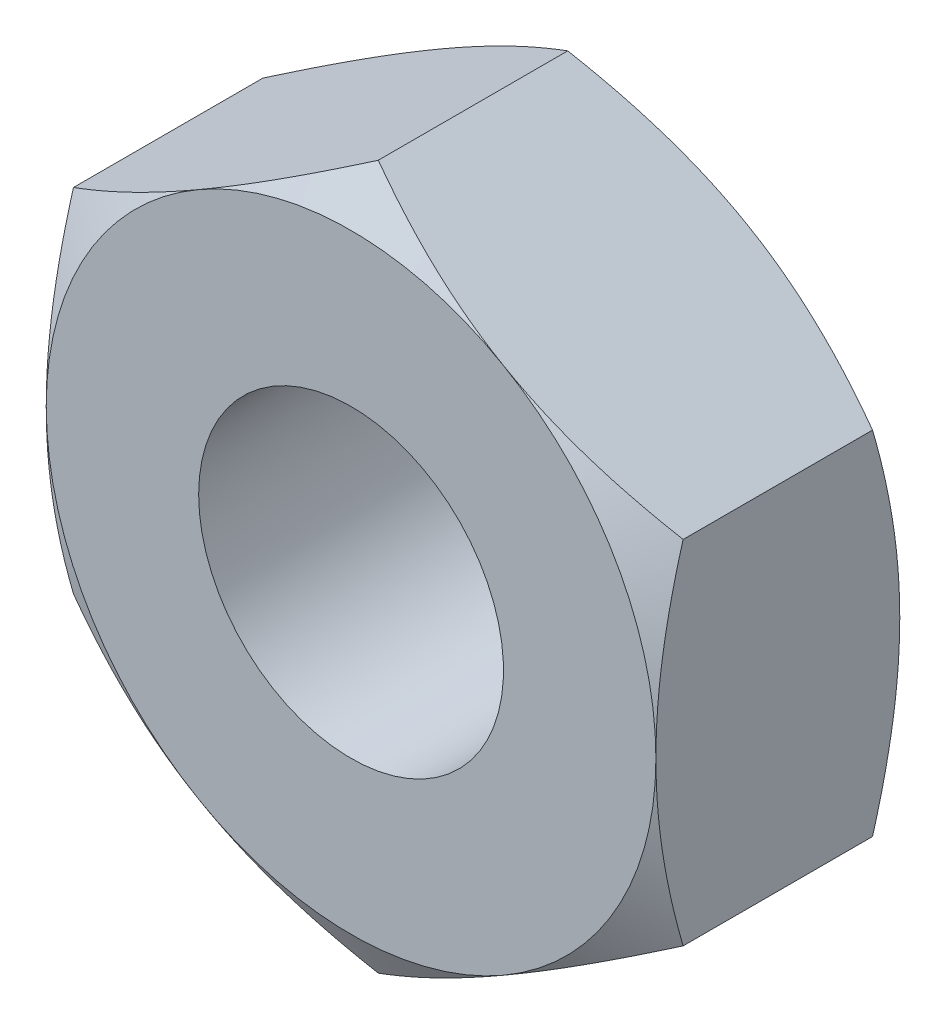
ISO-10303-21;
HEADER;
FILE_DESCRIPTION(('STEP AP214'),'2;1');
FILE_NAME('part.step','',(''),(''),'','','');
FILE_SCHEMA(('AUTOMOTIVE_DESIGN { 1 0 10303 214 1 1 1 1 }'));
ENDSEC;
DATA;
#1=APPLICATION_CONTEXT('core data for automotive mechanical design processes');
#2=APPLICATION_PROTOCOL_DEFINITION('international standard','automotive_design',2000,#1);
#3=PRODUCT_CONTEXT('',#1,'mechanical');
#4=PRODUCT('Part','Part','',(#3));
#5=PRODUCT_RELATED_PRODUCT_CATEGORY('part','',(#4));
#6=PRODUCT_DEFINITION_FORMATION('','',#4);
#7=PRODUCT_DEFINITION_CONTEXT('part definition',#1,'design');
#8=PRODUCT_DEFINITION('design','',#6,#7);
#9=PRODUCT_DEFINITION_SHAPE('','',#8);
#10=(LENGTH_UNIT() NAMED_UNIT(*) SI_UNIT(.MILLI.,.METRE.));
#11=(NAMED_UNIT(*) PLANE_ANGLE_UNIT() SI_UNIT($,.RADIAN.));
#12=(NAMED_UNIT(*) SI_UNIT($,.STERADIAN.) SOLID_ANGLE_UNIT());
#13=UNCERTAINTY_MEASURE_WITH_UNIT(LENGTH_MEASURE(1.E-05),#10,'distance_accuracy_value','');
#14=(GEOMETRIC_REPRESENTATION_CONTEXT(3) GLOBAL_UNCERTAINTY_ASSIGNED_CONTEXT((#13)) GLOBAL_UNIT_ASSIGNED_CONTEXT((#10,
#11,#12)) REPRESENTATION_CONTEXT('',''));
#15=CARTESIAN_POINT('',(0.,0.,0.));
#16=DIRECTION('',(0.,0.,1.));
#17=DIRECTION('',(1.,0.,0.));
#18=AXIS2_PLACEMENT_3D('',#15,#16,#17);
#19=CARTESIAN_POINT('',(0.,2.88675134594813,1.));
#20=DIRECTION('',(0.5,-0.866025403784438,0.));
#21=DIRECTION('',(0.866025403784438,0.5,0.));
#22=AXIS2_PLACEMENT_3D('',#19,#20,#21);
#23=PLANE('',#22);
#24=DIRECTION('',(0.,0.,-1.));
#25=VECTOR('',#24,1.);
#26=CARTESIAN_POINT('',(0.,2.88675134594813,1.));
#27=LINE('',#26,#25);
#28=CARTESIAN_POINT('',(0.,2.88675134594813,0.776709006307399));
#29=VERTEX_POINT('',#28);
#30=CARTESIAN_POINT('',(0.,2.88675134594813,-0.776709006307399));
#31=VERTEX_POINT('',#30);
#32=EDGE_CURVE('E254',#29,#31,#27,.T.);
#33=ORIENTED_EDGE('',*,*,#32,.T.);
#34=CARTESIAN_POINT('',(0.000199999999999784,2.88686681600197,-0.776642335640892));
#35=CARTESIAN_POINT('',(-0.109663234734872,2.82343724785375,-0.813278379892374));
#36=CARTESIAN_POINT('',(-0.220474799896526,2.75946016087834,-0.846597781034944));
#37=CARTESIAN_POINT('',(-0.44401683346605,2.63039810762178,-0.904757714442142));
#38=CARTESIAN_POINT('',(-0.556751274528388,2.5653108477275,-0.929577670852262));
#39=CARTESIAN_POINT('',(-0.780822993875269,2.43594298024479,-0.968214348558948));
#40=CARTESIAN_POINT('',(-0.892125791767377,2.37168227992023,-0.982288203814361));
#41=CARTESIAN_POINT('',(-1.11525522746833,2.24285844015415,-0.99909084764725));
#42=CARTESIAN_POINT('',(-1.22708105401423,2.17829576909553,-1.00183354879637));
#43=CARTESIAN_POINT('',(-1.43604197555152,2.05765212479586,-0.996134239991947));
#44=CARTESIAN_POINT('',(-1.53320831755773,2.0015531110824,-0.989091605618139));
#45=CARTESIAN_POINT('',(-1.726907949711,1.88972057631678,-0.966768580875058));
#46=CARTESIAN_POINT('',(-1.82344056965973,1.8339874422038,-0.951480561559734));
#47=CARTESIAN_POINT('',(-2.01753972174048,1.7219242445005,-0.913260906155581));
#48=CARTESIAN_POINT('',(-2.11508168178214,1.66560836761316,-0.890167223874483));
#49=CARTESIAN_POINT('',(-2.30871060807609,1.55381665489446,-0.837753343422087));
#50=CARTESIAN_POINT('',(-2.40480005588618,1.49833938633502,-0.808445464375452));
#51=CARTESIAN_POINT('',(-2.5002,1.44326020292023,-0.776642335640893));
#52=B_SPLINE_CURVE_WITH_KNOTS('',3,(#34,#35,#36,#37,#38,#39,#40,#41,#42,#43,#44,#45,#46,#47,#48,
#49,#50,#51),.UNSPECIFIED.,.F.,.F.,(4,2,2,2,2,2,2,2,4),(0.,0.396285827362227,0.793524330152051,
1.18093086852114,1.56786160134475,1.90479741793733,2.24204551660463,2.58677531536756,
2.93082800105256),.UNSPECIFIED.);
#53=CARTESIAN_POINT('',(-1.25,2.1650635094611,-1.));
#54=VERTEX_POINT('',#53);
#55=EDGE_CURVE('E61',#31,#54,#52,.T.);
#56=ORIENTED_EDGE('',*,*,#55,.T.);
#57=CARTESIAN_POINT('',(-2.5,1.44337567297406,-0.776709006307399));
#58=VERTEX_POINT('',#57);
#59=EDGE_CURVE('E181',#54,#58,#52,.T.);
#60=ORIENTED_EDGE('',*,*,#59,.T.);
#61=DIRECTION('',(0.,0.,-1.));
#62=VECTOR('',#61,1.);
#63=CARTESIAN_POINT('',(-2.5,1.44337567297406,1.));
#64=LINE('',#63,#62);
#65=CARTESIAN_POINT('',(-2.5,1.44337567297406,0.776709006307399));
#66=VERTEX_POINT('',#65);
#67=EDGE_CURVE('E269',#66,#58,#64,.T.);
#68=ORIENTED_EDGE('',*,*,#67,.F.);
#69=CARTESIAN_POINT('',(0.000199999999999784,2.88686681600197,0.776642335640892));
#70=CARTESIAN_POINT('',(-0.109663234734872,2.82343724785375,0.813278379892374));
#71=CARTESIAN_POINT('',(-0.220474799896526,2.75946016087834,0.846597781034944));
#72=CARTESIAN_POINT('',(-0.44401683346605,2.63039810762178,0.904757714442142));
#73=CARTESIAN_POINT('',(-0.556751274528388,2.5653108477275,0.929577670852262));
#74=CARTESIAN_POINT('',(-0.780822993875269,2.43594298024479,0.968214348558948));
#75=CARTESIAN_POINT('',(-0.892125791767377,2.37168227992023,0.982288203814361));
#76=CARTESIAN_POINT('',(-1.11525522746833,2.24285844015415,0.99909084764725));
#77=CARTESIAN_POINT('',(-1.22708105401423,2.17829576909553,1.00183354879637));
#78=CARTESIAN_POINT('',(-1.43604197555152,2.05765212479586,0.996134239991947));
#79=CARTESIAN_POINT('',(-1.53320831755773,2.0015531110824,0.989091605618139));
#80=CARTESIAN_POINT('',(-1.726907949711,1.88972057631678,0.966768580875058));
#81=CARTESIAN_POINT('',(-1.82344056965973,1.8339874422038,0.951480561559734));
#82=CARTESIAN_POINT('',(-2.01753972174048,1.7219242445005,0.913260906155581));
#83=CARTESIAN_POINT('',(-2.11508168178214,1.66560836761316,0.890167223874483));
#84=CARTESIAN_POINT('',(-2.30871060807609,1.55381665489446,0.837753343422087));
#85=CARTESIAN_POINT('',(-2.40480005588618,1.49833938633502,0.808445464375452));
#86=CARTESIAN_POINT('',(-2.5002,1.44326020292023,0.776642335640893));
#87=B_SPLINE_CURVE_WITH_KNOTS('',3,(#69,#70,#71,#72,#73,#74,#75,#76,#77,#78,#79,#80,#81,#82,#83,
#84,#85,#86),.UNSPECIFIED.,.F.,.F.,(4,2,2,2,2,2,2,2,4),(0.,0.396285827362227,0.793524330152051,
1.18093086852114,1.56786160134475,1.90479741793733,2.24204551660463,2.58677531536756,
2.93082800105256),.UNSPECIFIED.);
#88=CARTESIAN_POINT('',(-1.25,2.1650635094611,1.));
#89=VERTEX_POINT('',#88);
#90=EDGE_CURVE('E244',#89,#66,#87,.T.);
#91=ORIENTED_EDGE('',*,*,#90,.F.);
#92=EDGE_CURVE('E250',#29,#89,#87,.T.);
#93=ORIENTED_EDGE('',*,*,#92,.F.);
#94=EDGE_LOOP('',(#33,#56,#60,#68,#91,#93));
#95=FACE_BOUND('',#94,.T.);
#96=ADVANCED_FACE('F39',(#95),#23,.F.);
#97=CARTESIAN_POINT('',(-2.5,1.44337567297406,1.));
#98=DIRECTION('',(1.,0.,0.));
#99=DIRECTION('',(0.,1.,0.));
#100=AXIS2_PLACEMENT_3D('',#97,#98,#99);
#101=PLANE('',#100);
#102=ORIENTED_EDGE('',*,*,#67,.T.);
#103=CARTESIAN_POINT('',(-2.5,-3.93682850943835,0.249121229699886));
#104=CARTESIAN_POINT('',(-2.5,-3.82710818674533,0.195659542097123));
#105=CARTESIAN_POINT('',(-2.5,-3.71714229258268,0.142693517568857));
#106=CARTESIAN_POINT('',(-2.5,-3.49658896269447,0.0380304645715176));
#107=CARTESIAN_POINT('',(-2.5,-3.38600143737848,-0.0136663749020606));
#108=CARTESIAN_POINT('',(-2.5,-3.16353296332601,-0.115760762816465));
#109=CARTESIAN_POINT('',(-2.5,-3.0516482830694,-0.166150207172396));
#110=CARTESIAN_POINT('',(-2.5,-2.82700953528649,-0.26494489286274));
#111=CARTESIAN_POINT('',(-2.5,-2.71425550745767,-0.313350224168629));
#112=CARTESIAN_POINT('',(-2.5,-2.48386509203845,-0.409250531279129));
#113=CARTESIAN_POINT('',(-2.5,-2.36619261264712,-0.456659258118714));
#114=CARTESIAN_POINT('',(-2.5,-2.12949324990812,-0.548031150053263));
#115=CARTESIAN_POINT('',(-2.5,-2.01046621957356,-0.591993937055166));
#116=CARTESIAN_POINT('',(-2.5,-1.77107239218997,-0.675363617991618));
#117=CARTESIAN_POINT('',(-2.5,-1.65070866259457,-0.714779234358659));
#118=CARTESIAN_POINT('',(-2.5,-1.40825562823912,-0.787829555094567));
#119=CARTESIAN_POINT('',(-2.5,-1.28616686057156,-0.821466017679695));
#120=CARTESIAN_POINT('',(-2.5,-1.04086978155746,-0.881205191532447));
#121=CARTESIAN_POINT('',(-2.5,-0.917671922346255,-0.907350047994996));
#122=CARTESIAN_POINT('',(-2.5,-0.669683589349523,-0.950666825819554));
#123=CARTESIAN_POINT('',(-2.5,-0.544893290267859,-0.967839722956031));
#124=CARTESIAN_POINT('',(-2.5,-0.29599732632917,-0.991620857761934));
#125=CARTESIAN_POINT('',(-2.5,-0.171905423280525,-0.998369567268804));
#126=CARTESIAN_POINT('',(-2.5,0.0764102573857549,-1.00110397613969));
#127=CARTESIAN_POINT('',(-2.5,0.20063403692071,-0.997089516817631));
#128=CARTESIAN_POINT('',(-2.5,0.409769806870475,-0.981559996102806));
#129=CARTESIAN_POINT('',(-2.5,0.494897466088904,-0.972764652706634));
#130=CARTESIAN_POINT('',(-2.5,0.664564692108646,-0.950635409234294));
#131=CARTESIAN_POINT('',(-2.5,0.749104184203143,-0.937300942979891));
#132=CARTESIAN_POINT('',(-2.5,1.0017058627616,-0.891186146632077));
#133=CARTESIAN_POINT('',(-2.5,1.1686679832358,-0.852301454715724));
#134=CARTESIAN_POINT('',(-2.5,1.41845743087391,-0.78441553445603));
#135=CARTESIAN_POINT('',(-2.5,1.5025661443771,-0.759856802883347));
#136=CARTESIAN_POINT('',(-2.5,1.66996751852723,-0.70807555389219));
#137=CARTESIAN_POINT('',(-2.5,1.75326017287369,-0.680853015925225));
#138=CARTESIAN_POINT('',(-2.5,1.919054631171,-0.624190358124172));
#139=CARTESIAN_POINT('',(-2.5,2.00155665027357,-0.594750862078595));
#140=CARTESIAN_POINT('',(-2.5,2.16586872810113,-0.534011913570538));
#141=CARTESIAN_POINT('',(-2.5,2.2476788026732,-0.502712503836761));
#142=CARTESIAN_POINT('',(-2.5,2.46799178693974,-0.416009645867712));
#143=CARTESIAN_POINT('',(-2.5,2.60591366157588,-0.359131154184256));
#144=CARTESIAN_POINT('',(-2.5,2.8803344673623,-0.242027329802788));
#145=CARTESIAN_POINT('',(-2.5,3.01683323795504,-0.181801624215579));
#146=CARTESIAN_POINT('',(-2.5,3.28873049165575,-0.0587995610617743));
#147=CARTESIAN_POINT('',(-2.5,3.42412857257666,0.00397768262169567));
#148=CARTESIAN_POINT('',(-2.5,3.69400503953586,0.131482506906972));
#149=CARTESIAN_POINT('',(-2.5,3.828483397073,0.196210147616306));
#150=CARTESIAN_POINT('',(-2.5,4.23123577312874,0.392856957990091));
#151=CARTESIAN_POINT('',(-2.5,4.49840113602191,0.527043764718587));
#152=CARTESIAN_POINT('',(-2.5,5.03071112748541,0.799201495008964));
#153=CARTESIAN_POINT('',(-2.5,5.29585616948873,0.937171616256438));
#154=CARTESIAN_POINT('',(-2.5,5.79675686599543,1.20093587261578));
#155=CARTESIAN_POINT('',(-2.5,6.03264923857129,1.32647082001161));
#156=CARTESIAN_POINT('',(-2.5,6.50364132449825,1.57905138080748));
#157=CARTESIAN_POINT('',(-2.5,6.73874098771157,1.70609708754293));
#158=CARTESIAN_POINT('',(-2.5,7.20754017691077,1.96087898784698));
#159=CARTESIAN_POINT('',(-2.5,7.44124175185041,2.08861141579151));
#160=CARTESIAN_POINT('',(-2.5,7.90814984401279,2.34493448564363));
#161=CARTESIAN_POINT('',(-2.5,8.1413563990505,2.47352505864071));
#162=CARTESIAN_POINT('',(-2.5,8.37438915220787,2.60242765496148));
#163=B_SPLINE_CURVE_WITH_KNOTS('',3,(#103,#104,#105,#106,#107,#108,#109,#110,#111,#112,#113,
#114,#115,#116,#117,#118,#119,#120,#121,#122,#123,#124,#125,#126,#127,#128,#129,#130,#131,#132,
#133,#134,#135,#136,#137,#138,#139,#140,#141,#142,#143,#144,#145,#146,#147,#148,#149,#150,#151,
#152,#153,#154,#155,#156,#157,#158,#159,#160,#161,#162),.UNSPECIFIED.,.F.,.F.,(4,2,2,2,2,2,2,2,
2,2,2,2,2,2,2,2,2,2,2,2,2,2,2,2,2,2,2,2,2,4),(0.,0.366160325606037,0.73237484975533,
1.10048369154756,1.46857582258919,1.84912519213889,2.22971625778837,2.60956468392041,
2.98929734174599,3.36684981861448,3.74436122498937,4.11673964389327,4.48912355296384,
4.74574269367437,5.00239385498622,5.51594572541215,5.7787842102234,6.04162472271969,
6.30439155378179,6.56715235050553,7.01465571034159,7.46220902365055,7.90991911734495,
8.357643022753,9.25449743540887,10.1511631041212,10.9528026994147,11.7544920803731,
12.5534819257233,13.3524083648842),.UNSPECIFIED.);
#164=CARTESIAN_POINT('',(-2.5,0.,-1.));
#165=VERTEX_POINT('',#164);
#166=EDGE_CURVE('E339',#58,#165,#163,.F.);
#167=ORIENTED_EDGE('',*,*,#166,.T.);
#168=CARTESIAN_POINT('',(-2.5,-1.44337567297407,-0.776709006307399));
#169=VERTEX_POINT('',#168);
#170=EDGE_CURVE('E207',#165,#169,#163,.F.);
#171=ORIENTED_EDGE('',*,*,#170,.T.);
#172=DIRECTION('',(0.,0.,-1.));
#173=VECTOR('',#172,1.);
#174=CARTESIAN_POINT('',(-2.5,-1.44337567297407,1.));
#175=LINE('',#174,#173);
#176=CARTESIAN_POINT('',(-2.5,-1.44337567297407,0.776709006307399));
#177=VERTEX_POINT('',#176);
#178=EDGE_CURVE('E266',#177,#169,#175,.T.);
#179=ORIENTED_EDGE('',*,*,#178,.F.);
#180=CARTESIAN_POINT('',(-2.5,-3.93682850943835,-0.249121229699886));
#181=CARTESIAN_POINT('',(-2.5,-3.82710818674533,-0.195659542097123));
#182=CARTESIAN_POINT('',(-2.5,-3.71714229258268,-0.142693517568857));
#183=CARTESIAN_POINT('',(-2.5,-3.49658896269447,-0.0380304645715176));
#184=CARTESIAN_POINT('',(-2.5,-3.38600143737848,0.0136663749020606));
#185=CARTESIAN_POINT('',(-2.5,-3.16353296332601,0.115760762816465));
#186=CARTESIAN_POINT('',(-2.5,-3.0516482830694,0.166150207172396));
#187=CARTESIAN_POINT('',(-2.5,-2.82700953528649,0.26494489286274));
#188=CARTESIAN_POINT('',(-2.5,-2.71425550745767,0.313350224168629));
#189=CARTESIAN_POINT('',(-2.5,-2.48386509203845,0.409250531279129));
#190=CARTESIAN_POINT('',(-2.5,-2.36619261264712,0.456659258118714));
#191=CARTESIAN_POINT('',(-2.5,-2.12949324990812,0.548031150053263));
#192=CARTESIAN_POINT('',(-2.5,-2.01046621957356,0.591993937055166));
#193=CARTESIAN_POINT('',(-2.5,-1.77107239218997,0.675363617991618));
#194=CARTESIAN_POINT('',(-2.5,-1.65070866259457,0.714779234358659));
#195=CARTESIAN_POINT('',(-2.5,-1.40825562823912,0.787829555094567));
#196=CARTESIAN_POINT('',(-2.5,-1.28616686057156,0.821466017679695));
#197=CARTESIAN_POINT('',(-2.5,-1.04086978155746,0.881205191532447));
#198=CARTESIAN_POINT('',(-2.5,-0.917671922346255,0.907350047994996));
#199=CARTESIAN_POINT('',(-2.5,-0.669683589349523,0.950666825819554));
#200=CARTESIAN_POINT('',(-2.5,-0.544893290267859,0.967839722956031));
#201=CARTESIAN_POINT('',(-2.5,-0.29599732632917,0.991620857761934));
#202=CARTESIAN_POINT('',(-2.5,-0.171905423280525,0.998369567268804));
#203=CARTESIAN_POINT('',(-2.5,0.0764102573857549,1.00110397613969));
#204=CARTESIAN_POINT('',(-2.5,0.20063403692071,0.997089516817631));
#205=CARTESIAN_POINT('',(-2.5,0.409769806870475,0.981559996102806));
#206=CARTESIAN_POINT('',(-2.5,0.494897466088904,0.972764652706634));
#207=CARTESIAN_POINT('',(-2.5,0.664564692108646,0.950635409234294));
#208=CARTESIAN_POINT('',(-2.5,0.749104184203143,0.937300942979891));
#209=CARTESIAN_POINT('',(-2.5,1.0017058627616,0.891186146632077));
#210=CARTESIAN_POINT('',(-2.5,1.1686679832358,0.852301454715724));
#211=CARTESIAN_POINT('',(-2.5,1.41845743087391,0.78441553445603));
#212=CARTESIAN_POINT('',(-2.5,1.5025661443771,0.759856802883347));
#213=CARTESIAN_POINT('',(-2.5,1.66996751852723,0.70807555389219));
#214=CARTESIAN_POINT('',(-2.5,1.75326017287369,0.680853015925225));
#215=CARTESIAN_POINT('',(-2.5,1.919054631171,0.624190358124172));
#216=CARTESIAN_POINT('',(-2.5,2.00155665027357,0.594750862078595));
#217=CARTESIAN_POINT('',(-2.5,2.16586872810113,0.534011913570538));
#218=CARTESIAN_POINT('',(-2.5,2.2476788026732,0.502712503836761));
#219=CARTESIAN_POINT('',(-2.5,2.46799178693974,0.416009645867712));
#220=CARTESIAN_POINT('',(-2.5,2.60591366157588,0.359131154184256));
#221=CARTESIAN_POINT('',(-2.5,2.8803344673623,0.242027329802788));
#222=CARTESIAN_POINT('',(-2.5,3.01683323795504,0.181801624215579));
#223=CARTESIAN_POINT('',(-2.5,3.28873049165575,0.0587995610617743));
#224=CARTESIAN_POINT('',(-2.5,3.42412857257666,-0.00397768262169567));
#225=CARTESIAN_POINT('',(-2.5,3.69400503953586,-0.131482506906972));
#226=CARTESIAN_POINT('',(-2.5,3.828483397073,-0.196210147616306));
#227=CARTESIAN_POINT('',(-2.5,4.23123577312874,-0.392856957990091));
#228=CARTESIAN_POINT('',(-2.5,4.49840113602191,-0.527043764718587));
#229=CARTESIAN_POINT('',(-2.5,5.03071112748541,-0.799201495008964));
#230=CARTESIAN_POINT('',(-2.5,5.29585616948873,-0.937171616256438));
#231=CARTESIAN_POINT('',(-2.5,5.79675686599543,-1.20093587261578));
#232=CARTESIAN_POINT('',(-2.5,6.03264923857129,-1.32647082001161));
#233=CARTESIAN_POINT('',(-2.5,6.50364132449825,-1.57905138080748));
#234=CARTESIAN_POINT('',(-2.5,6.73874098771157,-1.70609708754293));
#235=CARTESIAN_POINT('',(-2.5,7.20754017691077,-1.96087898784698));
#236=CARTESIAN_POINT('',(-2.5,7.44124175185041,-2.08861141579151));
#237=CARTESIAN_POINT('',(-2.5,7.90814984401279,-2.34493448564363));
#238=CARTESIAN_POINT('',(-2.5,8.1413563990505,-2.47352505864071));
#239=CARTESIAN_POINT('',(-2.5,8.37438915220787,-2.60242765496148));
#240=B_SPLINE_CURVE_WITH_KNOTS('',3,(#180,#181,#182,#183,#184,#185,#186,#187,#188,#189,#190,
#191,#192,#193,#194,#195,#196,#197,#198,#199,#200,#201,#202,#203,#204,#205,#206,#207,#208,#209,
#210,#211,#212,#213,#214,#215,#216,#217,#218,#219,#220,#221,#222,#223,#224,#225,#226,#227,#228,
#229,#230,#231,#232,#233,#234,#235,#236,#237,#238,#239),.UNSPECIFIED.,.F.,.F.,(4,2,2,2,2,2,2,2,
2,2,2,2,2,2,2,2,2,2,2,2,2,2,2,2,2,2,2,2,2,4),(0.,0.366160325606037,0.73237484975533,
1.10048369154756,1.46857582258919,1.84912519213889,2.22971625778837,2.60956468392041,
2.98929734174599,3.36684981861448,3.74436122498937,4.11673964389327,4.48912355296384,
4.74574269367437,5.00239385498622,5.51594572541215,5.7787842102234,6.04162472271969,
6.30439155378179,6.56715235050553,7.01465571034159,7.46220902365055,7.90991911734495,
8.357643022753,9.25449743540887,10.1511631041212,10.9528026994147,11.7544920803731,
12.5534819257233,13.3524083648842),.UNSPECIFIED.);
#241=CARTESIAN_POINT('',(-2.5,0.,1.));
#242=VERTEX_POINT('',#241);
#243=EDGE_CURVE('E237',#242,#177,#240,.F.);
#244=ORIENTED_EDGE('',*,*,#243,.F.);
#245=EDGE_CURVE('E243',#66,#242,#240,.F.);
#246=ORIENTED_EDGE('',*,*,#245,.F.);
#247=EDGE_LOOP('',(#102,#167,#171,#179,#244,#246));
#248=FACE_BOUND('',#247,.T.);
#249=ADVANCED_FACE('F216',(#248),#101,.F.);
#250=CARTESIAN_POINT('',(-2.5,-1.44337567297407,1.));
#251=DIRECTION('',(0.5,0.866025403784439,0.));
#252=DIRECTION('',(-0.866025403784439,0.5,0.));
#253=AXIS2_PLACEMENT_3D('',#250,#251,#252);
#254=PLANE('',#253);
#255=ORIENTED_EDGE('',*,*,#178,.T.);
#256=CARTESIAN_POINT('',(-2.5002,-1.44326020292023,-0.776642335640892));
#257=CARTESIAN_POINT('',(-2.39033676526513,-1.50668977106845,-0.813278379892375));
#258=CARTESIAN_POINT('',(-2.27952520010347,-1.57066685804385,-0.846597781034944));
#259=CARTESIAN_POINT('',(-2.05598316653395,-1.69972891130041,-0.904757714442142));
#260=CARTESIAN_POINT('',(-1.94324872547161,-1.7648161711947,-0.929577670852261));
#261=CARTESIAN_POINT('',(-1.71917700612473,-1.8941840386774,-0.968214348558948));
#262=CARTESIAN_POINT('',(-1.60787420823262,-1.95844473900197,-0.982288203814361));
#263=CARTESIAN_POINT('',(-1.38474477253167,-2.08726857876805,-0.99909084764725));
#264=CARTESIAN_POINT('',(-1.27291894598577,-2.15183124982667,-1.00183354879637));
#265=CARTESIAN_POINT('',(-1.06395802444848,-2.27247489412634,-0.996134239991946));
#266=CARTESIAN_POINT('',(-0.966791682442268,-2.32857390783979,-0.989091605618138));
#267=CARTESIAN_POINT('',(-0.773092050288997,-2.44040644260542,-0.966768580875057));
#268=CARTESIAN_POINT('',(-0.676559430340267,-2.4961395767184,-0.951480561559732));
#269=CARTESIAN_POINT('',(-0.482460278259524,-2.60820277442169,-0.913260906155579));
#270=CARTESIAN_POINT('',(-0.384918318217859,-2.66451865130903,-0.890167223874483));
#271=CARTESIAN_POINT('',(-0.191289391923914,-2.77631036402774,-0.837753343422087));
#272=CARTESIAN_POINT('',(-0.0951999441138231,-2.83178763258718,-0.808445464375452));
#273=CARTESIAN_POINT('',(0.000200000000000678,-2.88686681600197,-0.776642335640892));
#274=B_SPLINE_CURVE_WITH_KNOTS('',3,(#256,#257,#258,#259,#260,#261,#262,#263,#264,#265,#266,
#267,#268,#269,#270,#271,#272,#273),.UNSPECIFIED.,.F.,.F.,(4,2,2,2,2,2,2,2,4),(0.,
0.396285827362227,0.793524330152051,1.18093086852114,1.56786160134475,1.90479741793733,
2.24204551660463,2.58677531536756,2.93082800105256),.UNSPECIFIED.);
#275=CARTESIAN_POINT('',(-1.25,-2.1650635094611,-1.));
#276=VERTEX_POINT('',#275);
#277=EDGE_CURVE('E205',#169,#276,#274,.T.);
#278=ORIENTED_EDGE('',*,*,#277,.T.);
#279=CARTESIAN_POINT('',(0.,-2.88675134594813,-0.776709006307398));
#280=VERTEX_POINT('',#279);
#281=EDGE_CURVE('E198',#276,#280,#274,.T.);
#282=ORIENTED_EDGE('',*,*,#281,.T.);
#283=DIRECTION('',(0.,0.,-1.));
#284=VECTOR('',#283,1.);
#285=CARTESIAN_POINT('',(0.,-2.88675134594813,1.));
#286=LINE('',#285,#284);
#287=CARTESIAN_POINT('',(0.,-2.88675134594813,0.776709006307398));
#288=VERTEX_POINT('',#287);
#289=EDGE_CURVE('E263',#288,#280,#286,.T.);
#290=ORIENTED_EDGE('',*,*,#289,.F.);
#291=CARTESIAN_POINT('',(-2.5002,-1.44326020292023,0.776642335640892));
#292=CARTESIAN_POINT('',(-2.39033676526513,-1.50668977106845,0.813278379892375));
#293=CARTESIAN_POINT('',(-2.27952520010347,-1.57066685804385,0.846597781034944));
#294=CARTESIAN_POINT('',(-2.05598316653395,-1.69972891130041,0.904757714442142));
#295=CARTESIAN_POINT('',(-1.94324872547161,-1.7648161711947,0.929577670852261));
#296=CARTESIAN_POINT('',(-1.71917700612473,-1.8941840386774,0.968214348558948));
#297=CARTESIAN_POINT('',(-1.60787420823262,-1.95844473900197,0.982288203814361));
#298=CARTESIAN_POINT('',(-1.38474477253167,-2.08726857876805,0.99909084764725));
#299=CARTESIAN_POINT('',(-1.27291894598577,-2.15183124982667,1.00183354879637));
#300=CARTESIAN_POINT('',(-1.06395802444848,-2.27247489412634,0.996134239991946));
#301=CARTESIAN_POINT('',(-0.966791682442268,-2.32857390783979,0.989091605618138));
#302=CARTESIAN_POINT('',(-0.773092050288997,-2.44040644260542,0.966768580875057));
#303=CARTESIAN_POINT('',(-0.676559430340267,-2.4961395767184,0.951480561559732));
#304=CARTESIAN_POINT('',(-0.482460278259524,-2.60820277442169,0.913260906155579));
#305=CARTESIAN_POINT('',(-0.384918318217859,-2.66451865130903,0.890167223874483));
#306=CARTESIAN_POINT('',(-0.191289391923914,-2.77631036402774,0.837753343422087));
#307=CARTESIAN_POINT('',(-0.0951999441138231,-2.83178763258718,0.808445464375452));
#308=CARTESIAN_POINT('',(0.000200000000000678,-2.88686681600197,0.776642335640892));
#309=B_SPLINE_CURVE_WITH_KNOTS('',3,(#291,#292,#293,#294,#295,#296,#297,#298,#299,#300,#301,
#302,#303,#304,#305,#306,#307,#308),.UNSPECIFIED.,.F.,.F.,(4,2,2,2,2,2,2,2,4),(0.,
0.396285827362227,0.793524330152051,1.18093086852114,1.56786160134475,1.90479741793733,
2.24204551660463,2.58677531536756,2.93082800105256),.UNSPECIFIED.);
#310=CARTESIAN_POINT('',(-1.25,-2.1650635094611,1.));
#311=VERTEX_POINT('',#310);
#312=EDGE_CURVE('E222',#311,#288,#309,.T.);
#313=ORIENTED_EDGE('',*,*,#312,.F.);
#314=EDGE_CURVE('E229',#177,#311,#309,.T.);
#315=ORIENTED_EDGE('',*,*,#314,.F.);
#316=EDGE_LOOP('',(#255,#278,#282,#290,#313,#315));
#317=FACE_BOUND('',#316,.T.);
#318=ADVANCED_FACE('F212',(#317),#254,.F.);
#319=CARTESIAN_POINT('',(0.,-2.88675134594813,1.));
#320=DIRECTION('',(-0.5,0.866025403784438,0.));
#321=DIRECTION('',(-0.866025403784438,-0.5,0.));
#322=AXIS2_PLACEMENT_3D('',#319,#320,#321);
#323=PLANE('',#322);
#324=ORIENTED_EDGE('',*,*,#289,.T.);
#325=CARTESIAN_POINT('',(-0.000199999999999336,-2.88686681600197,-0.776642335640891));
#326=CARTESIAN_POINT('',(0.109663234734872,-2.82343724785375,-0.813278379892374));
#327=CARTESIAN_POINT('',(0.220474799896526,-2.75946016087834,-0.846597781034944));
#328=CARTESIAN_POINT('',(0.44401683346605,-2.63039810762178,-0.904757714442142));
#329=CARTESIAN_POINT('',(0.556751274528389,-2.5653108477275,-0.929577670852261));
#330=CARTESIAN_POINT('',(0.78082299387527,-2.43594298024479,-0.968214348558948));
#331=CARTESIAN_POINT('',(0.892125791767378,-2.37168227992023,-0.982288203814361));
#332=CARTESIAN_POINT('',(1.11525522746833,-2.24285844015415,-0.99909084764725));
#333=CARTESIAN_POINT('',(1.22708105401423,-2.17829576909553,-1.00183354879637));
#334=CARTESIAN_POINT('',(1.43604197555152,-2.05765212479586,-0.996134239991946));
#335=CARTESIAN_POINT('',(1.53320831755773,-2.0015531110824,-0.989091605618138));
#336=CARTESIAN_POINT('',(1.726907949711,-1.88972057631678,-0.966768580875057));
#337=CARTESIAN_POINT('',(1.82344056965973,-1.8339874422038,-0.951480561559733));
#338=CARTESIAN_POINT('',(2.01753972174048,-1.7219242445005,-0.91326090615558));
#339=CARTESIAN_POINT('',(2.11508168178214,-1.66560836761316,-0.890167223874483));
#340=CARTESIAN_POINT('',(2.30871060807609,-1.55381665489446,-0.837753343422087));
#341=CARTESIAN_POINT('',(2.40480005588618,-1.49833938633502,-0.808445464375452));
#342=CARTESIAN_POINT('',(2.5002,-1.44326020292023,-0.776642335640892));
#343=B_SPLINE_CURVE_WITH_KNOTS('',3,(#325,#326,#327,#328,#329,#330,#331,#332,#333,#334,#335,
#336,#337,#338,#339,#340,#341,#342),.UNSPECIFIED.,.F.,.F.,(4,2,2,2,2,2,2,2,4),(0.,
0.396285827362227,0.793524330152051,1.18093086852114,1.56786160134475,1.90479741793733,
2.24204551660463,2.58677531536756,2.93082800105257),.UNSPECIFIED.);
#344=CARTESIAN_POINT('',(1.25,-2.1650635094611,-1.));
#345=VERTEX_POINT('',#344);
#346=EDGE_CURVE('E206',#280,#345,#343,.T.);
#347=ORIENTED_EDGE('',*,*,#346,.T.);
#348=CARTESIAN_POINT('',(2.5,-1.44337567297418,-0.776709006307475));
#349=VERTEX_POINT('',#348);
#350=EDGE_CURVE('E191',#345,#349,#343,.T.);
#351=ORIENTED_EDGE('',*,*,#350,.T.);
#352=DIRECTION('',(0.,0.,-1.));
#353=VECTOR('',#352,1.);
#354=CARTESIAN_POINT('',(2.5,-1.44337567297406,1.));
#355=LINE('',#354,#353);
#356=CARTESIAN_POINT('',(2.5,-1.44337567297418,0.776709006307475));
#357=VERTEX_POINT('',#356);
#358=EDGE_CURVE('E260',#357,#349,#355,.T.);
#359=ORIENTED_EDGE('',*,*,#358,.F.);
#360=CARTESIAN_POINT('',(-0.000199999999999336,-2.88686681600197,0.776642335640891));
#361=CARTESIAN_POINT('',(0.109663234734872,-2.82343724785375,0.813278379892374));
#362=CARTESIAN_POINT('',(0.220474799896526,-2.75946016087834,0.846597781034944));
#363=CARTESIAN_POINT('',(0.44401683346605,-2.63039810762178,0.904757714442142));
#364=CARTESIAN_POINT('',(0.556751274528389,-2.5653108477275,0.929577670852261));
#365=CARTESIAN_POINT('',(0.78082299387527,-2.43594298024479,0.968214348558948));
#366=CARTESIAN_POINT('',(0.892125791767378,-2.37168227992023,0.982288203814361));
#367=CARTESIAN_POINT('',(1.11525522746833,-2.24285844015415,0.99909084764725));
#368=CARTESIAN_POINT('',(1.22708105401423,-2.17829576909553,1.00183354879637));
#369=CARTESIAN_POINT('',(1.43604197555152,-2.05765212479586,0.996134239991946));
#370=CARTESIAN_POINT('',(1.53320831755773,-2.0015531110824,0.989091605618138));
#371=CARTESIAN_POINT('',(1.726907949711,-1.88972057631678,0.966768580875057));
#372=CARTESIAN_POINT('',(1.82344056965973,-1.8339874422038,0.951480561559733));
#373=CARTESIAN_POINT('',(2.01753972174048,-1.7219242445005,0.91326090615558));
#374=CARTESIAN_POINT('',(2.11508168178214,-1.66560836761316,0.890167223874483));
#375=CARTESIAN_POINT('',(2.30871060807609,-1.55381665489446,0.837753343422087));
#376=CARTESIAN_POINT('',(2.40480005588618,-1.49833938633502,0.808445464375452));
#377=CARTESIAN_POINT('',(2.5002,-1.44326020292023,0.776642335640892));
#378=B_SPLINE_CURVE_WITH_KNOTS('',3,(#360,#361,#362,#363,#364,#365,#366,#367,#368,#369,#370,
#371,#372,#373,#374,#375,#376,#377),.UNSPECIFIED.,.F.,.F.,(4,2,2,2,2,2,2,2,4),(0.,
0.396285827362227,0.793524330152051,1.18093086852114,1.56786160134475,1.90479741793733,
2.24204551660463,2.58677531536756,2.93082800105257),.UNSPECIFIED.);
#379=CARTESIAN_POINT('',(1.25,-2.1650635094611,1.));
#380=VERTEX_POINT('',#379);
#381=EDGE_CURVE('E231',#380,#357,#378,.T.);
#382=ORIENTED_EDGE('',*,*,#381,.F.);
#383=EDGE_CURVE('E230',#288,#380,#378,.T.);
#384=ORIENTED_EDGE('',*,*,#383,.F.);
#385=EDGE_LOOP('',(#324,#347,#351,#359,#382,#384));
#386=FACE_BOUND('',#385,.T.);
#387=ADVANCED_FACE('F215',(#386),#323,.F.);
#388=CARTESIAN_POINT('',(2.5,-1.44337567297406,1.));
#389=DIRECTION('',(-1.,0.,0.));
#390=DIRECTION('',(0.,0.,1.));
#391=AXIS2_PLACEMENT_3D('',#388,#389,#390);
#392=PLANE('',#391);
#393=ORIENTED_EDGE('',*,*,#358,.T.);
#394=CARTESIAN_POINT('',(2.5,-3.93682850943835,0.249121229699887));
#395=CARTESIAN_POINT('',(2.5,-3.82710818674532,0.195659542097124));
#396=CARTESIAN_POINT('',(2.5,-3.71714229258268,0.142693517568858));
#397=CARTESIAN_POINT('',(2.5,-3.49658896269447,0.0380304645715181));
#398=CARTESIAN_POINT('',(2.5,-3.38600143737848,-0.01366637490206));
#399=CARTESIAN_POINT('',(2.5,-3.16353296332601,-0.115760762816464));
#400=CARTESIAN_POINT('',(2.5,-3.0516482830694,-0.166150207172395));
#401=CARTESIAN_POINT('',(2.5,-2.82700953528649,-0.264944892862739));
#402=CARTESIAN_POINT('',(2.5,-2.71425550745767,-0.313350224168628));
#403=CARTESIAN_POINT('',(2.5,-2.48386509203845,-0.409250531279128));
#404=CARTESIAN_POINT('',(2.5,-2.36619261264712,-0.456659258118713));
#405=CARTESIAN_POINT('',(2.5,-2.12949324990812,-0.548031150053263));
#406=CARTESIAN_POINT('',(2.5,-2.01046621957356,-0.591993937055166));
#407=CARTESIAN_POINT('',(2.5,-1.77107239218997,-0.675363617991618));
#408=CARTESIAN_POINT('',(2.5,-1.65070866259457,-0.714779234358658));
#409=CARTESIAN_POINT('',(2.5,-1.40825562823911,-0.787829555094566));
#410=CARTESIAN_POINT('',(2.5,-1.28616686057156,-0.821466017679695));
#411=CARTESIAN_POINT('',(2.5,-1.04086978155746,-0.881205191532447));
#412=CARTESIAN_POINT('',(2.5,-0.917671922346252,-0.907350047994995));
#413=CARTESIAN_POINT('',(2.5,-0.66968358934952,-0.950666825819554));
#414=CARTESIAN_POINT('',(2.5,-0.544893290267856,-0.967839722956031));
#415=CARTESIAN_POINT('',(2.5,-0.295997326329167,-0.991620857761933));
#416=CARTESIAN_POINT('',(2.5,-0.171905423280522,-0.998369567268804));
#417=CARTESIAN_POINT('',(2.5,0.0764102573857576,-1.00110397613968));
#418=CARTESIAN_POINT('',(2.5,0.200634036920712,-0.99708951681763));
#419=CARTESIAN_POINT('',(2.5,0.409769806870478,-0.981559996102805));
#420=CARTESIAN_POINT('',(2.5,0.494897466088907,-0.972764652706633));
#421=CARTESIAN_POINT('',(2.5,0.66456469210865,-0.950635409234293));
#422=CARTESIAN_POINT('',(2.5,0.749104184203146,-0.937300942979889));
#423=CARTESIAN_POINT('',(2.5,1.0017058627616,-0.891186146632075));
#424=CARTESIAN_POINT('',(2.5,1.1686679832358,-0.852301454715722));
#425=CARTESIAN_POINT('',(2.5,1.41845743087392,-0.784415534456029));
#426=CARTESIAN_POINT('',(2.5,1.5025661443771,-0.759856802883345));
#427=CARTESIAN_POINT('',(2.5,1.66996751852724,-0.708075553892189));
#428=CARTESIAN_POINT('',(2.5,1.75326017287369,-0.680853015925223));
#429=CARTESIAN_POINT('',(2.5,1.91905463117101,-0.62419035812417));
#430=CARTESIAN_POINT('',(2.5,2.00155665027358,-0.594750862078593));
#431=CARTESIAN_POINT('',(2.5,2.16586872810113,-0.534011913570536));
#432=CARTESIAN_POINT('',(2.5,2.24767880267321,-0.502712503836759));
#433=CARTESIAN_POINT('',(2.5,2.46799178693975,-0.41600964586771));
#434=CARTESIAN_POINT('',(2.5,2.60591366157588,-0.359131154184254));
#435=CARTESIAN_POINT('',(2.5,2.88033446736231,-0.242027329802786));
#436=CARTESIAN_POINT('',(2.5,3.01683323795504,-0.181801624215577));
#437=CARTESIAN_POINT('',(2.5,3.28873049165575,-0.0587995610617725));
#438=CARTESIAN_POINT('',(2.5,3.42412857257667,0.00397768262169701));
#439=CARTESIAN_POINT('',(2.5,3.69400503953587,0.131482506906974));
#440=CARTESIAN_POINT('',(2.5,3.828483397073,0.196210147616308));
#441=CARTESIAN_POINT('',(2.5,4.23123577312874,0.392856957990094));
#442=CARTESIAN_POINT('',(2.5,4.49840113602191,0.52704376471859));
#443=CARTESIAN_POINT('',(2.5,5.03071112748542,0.799201495008967));
#444=CARTESIAN_POINT('',(2.5,5.29585616948873,0.937171616256441));
#445=CARTESIAN_POINT('',(2.5,5.79675686599543,1.20093587261578));
#446=CARTESIAN_POINT('',(2.5,6.03264923857129,1.32647082001161));
#447=CARTESIAN_POINT('',(2.5,6.50364132449825,1.57905138080748));
#448=CARTESIAN_POINT('',(2.5,6.73874098771157,1.70609708754293));
#449=CARTESIAN_POINT('',(2.5,7.20754017691077,1.96087898784698));
#450=CARTESIAN_POINT('',(2.5,7.44124175185041,2.08861141579151));
#451=CARTESIAN_POINT('',(2.5,7.90814984401279,2.34493448564363));
#452=CARTESIAN_POINT('',(2.5,8.1413563990505,2.47352505864071));
#453=CARTESIAN_POINT('',(2.5,8.37438915220787,2.60242765496148));
#454=B_SPLINE_CURVE_WITH_KNOTS('',3,(#394,#395,#396,#397,#398,#399,#400,#401,#402,#403,#404,
#405,#406,#407,#408,#409,#410,#411,#412,#413,#414,#415,#416,#417,#418,#419,#420,#421,#422,#423,
#424,#425,#426,#427,#428,#429,#430,#431,#432,#433,#434,#435,#436,#437,#438,#439,#440,#441,#442,
#443,#444,#445,#446,#447,#448,#449,#450,#451,#452,#453),.UNSPECIFIED.,.F.,.F.,(4,2,2,2,2,2,2,2,
2,2,2,2,2,2,2,2,2,2,2,2,2,2,2,2,2,2,2,2,2,4),(0.,0.366160325606038,0.732374849755331,
1.10048369154756,1.46857582258919,1.84912519213889,2.22971625778837,2.60956468392041,
2.989297341746,3.36684981861448,3.74436122498937,4.11673964389328,4.48912355296384,
4.74574269367438,5.00239385498623,5.51594572541215,5.77878421022341,6.0416247227197,
6.3043915537818,6.56715235050553,7.0146557103416,7.46220902365055,7.90991911734495,
8.35764302275301,9.25449743540888,10.1511631041212,10.9528026994147,11.7544920803731,
12.5534819257233,13.3524083648842),.UNSPECIFIED.);
#455=CARTESIAN_POINT('',(2.5,0.,-1.));
#456=VERTEX_POINT('',#455);
#457=EDGE_CURVE('E155',#349,#456,#454,.T.);
#458=ORIENTED_EDGE('',*,*,#457,.T.);
#459=CARTESIAN_POINT('',(2.5,1.44337567297406,-0.776709006307398));
#460=VERTEX_POINT('',#459);
#461=EDGE_CURVE('E141',#456,#460,#454,.T.);
#462=ORIENTED_EDGE('',*,*,#461,.T.);
#463=DIRECTION('',(0.,0.,-1.));
#464=VECTOR('',#463,1.);
#465=CARTESIAN_POINT('',(2.5,1.44337567297406,1.));
#466=LINE('',#465,#464);
#467=CARTESIAN_POINT('',(2.5,1.44337567297406,0.776709006307398));
#468=VERTEX_POINT('',#467);
#469=EDGE_CURVE('E154',#468,#460,#466,.T.);
#470=ORIENTED_EDGE('',*,*,#469,.F.);
#471=CARTESIAN_POINT('',(2.5,-3.93682850943835,-0.249121229699887));
#472=CARTESIAN_POINT('',(2.5,-3.82710818674532,-0.195659542097124));
#473=CARTESIAN_POINT('',(2.5,-3.71714229258268,-0.142693517568858));
#474=CARTESIAN_POINT('',(2.5,-3.49658896269447,-0.0380304645715181));
#475=CARTESIAN_POINT('',(2.5,-3.38600143737848,0.01366637490206));
#476=CARTESIAN_POINT('',(2.5,-3.16353296332601,0.115760762816464));
#477=CARTESIAN_POINT('',(2.5,-3.0516482830694,0.166150207172395));
#478=CARTESIAN_POINT('',(2.5,-2.82700953528649,0.264944892862739));
#479=CARTESIAN_POINT('',(2.5,-2.71425550745767,0.313350224168628));
#480=CARTESIAN_POINT('',(2.5,-2.48386509203845,0.409250531279128));
#481=CARTESIAN_POINT('',(2.5,-2.36619261264712,0.456659258118713));
#482=CARTESIAN_POINT('',(2.5,-2.12949324990812,0.548031150053263));
#483=CARTESIAN_POINT('',(2.5,-2.01046621957355,0.591993937055166));
#484=CARTESIAN_POINT('',(2.5,-1.77107239218997,0.675363617991618));
#485=CARTESIAN_POINT('',(2.5,-1.65070866259457,0.714779234358658));
#486=CARTESIAN_POINT('',(2.5,-1.40825562823911,0.787829555094566));
#487=CARTESIAN_POINT('',(2.5,-1.28616686057156,0.821466017679695));
#488=CARTESIAN_POINT('',(2.5,-1.04086978155746,0.881205191532447));
#489=CARTESIAN_POINT('',(2.5,-0.917671922346253,0.907350047994995));
#490=CARTESIAN_POINT('',(2.5,-0.669683589349521,0.950666825819554));
#491=CARTESIAN_POINT('',(2.5,-0.544893290267857,0.967839722956031));
#492=CARTESIAN_POINT('',(2.5,-0.295997326329168,0.991620857761933));
#493=CARTESIAN_POINT('',(2.5,-0.171905423280523,0.998369567268804));
#494=CARTESIAN_POINT('',(2.5,0.0764102573857566,1.00110397613968));
#495=CARTESIAN_POINT('',(2.5,0.200634036920712,0.99708951681763));
#496=CARTESIAN_POINT('',(2.5,0.409769806870478,0.981559996102805));
#497=CARTESIAN_POINT('',(2.5,0.494897466088906,0.972764652706633));
#498=CARTESIAN_POINT('',(2.5,0.664564692108649,0.950635409234293));
#499=CARTESIAN_POINT('',(2.5,0.749104184203146,0.937300942979889));
#500=CARTESIAN_POINT('',(2.5,1.0017058627616,0.891186146632075));
#501=CARTESIAN_POINT('',(2.5,1.1686679832358,0.852301454715722));
#502=CARTESIAN_POINT('',(2.5,1.41845743087392,0.784415534456029));
#503=CARTESIAN_POINT('',(2.5,1.5025661443771,0.759856802883345));
#504=CARTESIAN_POINT('',(2.5,1.66996751852724,0.708075553892189));
#505=CARTESIAN_POINT('',(2.5,1.75326017287369,0.680853015925224));
#506=CARTESIAN_POINT('',(2.5,1.91905463117101,0.62419035812417));
#507=CARTESIAN_POINT('',(2.5,2.00155665027358,0.594750862078593));
#508=CARTESIAN_POINT('',(2.5,2.16586872810113,0.534011913570536));
#509=CARTESIAN_POINT('',(2.5,2.24767880267321,0.502712503836759));
#510=CARTESIAN_POINT('',(2.5,2.46799178693975,0.416009645867711));
#511=CARTESIAN_POINT('',(2.5,2.60591366157588,0.359131154184254));
#512=CARTESIAN_POINT('',(2.5,2.8803344673623,0.242027329802786));
#513=CARTESIAN_POINT('',(2.5,3.01683323795504,0.181801624215578));
#514=CARTESIAN_POINT('',(2.5,3.28873049165575,0.0587995610617729));
#515=CARTESIAN_POINT('',(2.5,3.42412857257667,-0.00397768262169728));
#516=CARTESIAN_POINT('',(2.5,3.69400503953587,-0.131482506906974));
#517=CARTESIAN_POINT('',(2.5,3.828483397073,-0.196210147616307));
#518=CARTESIAN_POINT('',(2.5,4.23123577312874,-0.392856957990093));
#519=CARTESIAN_POINT('',(2.5,4.49840113602191,-0.527043764718589));
#520=CARTESIAN_POINT('',(2.5,5.03071112748542,-0.799201495008966));
#521=CARTESIAN_POINT('',(2.5,5.29585616948873,-0.93717161625644));
#522=CARTESIAN_POINT('',(2.5,5.79675686599543,-1.20093587261578));
#523=CARTESIAN_POINT('',(2.5,6.03264923857129,-1.32647082001161));
#524=CARTESIAN_POINT('',(2.5,6.50364132449825,-1.57905138080748));
#525=CARTESIAN_POINT('',(2.5,6.73874098771157,-1.70609708754294));
#526=CARTESIAN_POINT('',(2.5,7.20754017691077,-1.96087898784698));
#527=CARTESIAN_POINT('',(2.5,7.44124175185041,-2.08861141579151));
#528=CARTESIAN_POINT('',(2.5,7.90814984401279,-2.34493448564363));
#529=CARTESIAN_POINT('',(2.5,8.14135639905051,-2.47352505864071));
#530=CARTESIAN_POINT('',(2.5,8.37438915220787,-2.60242765496148));
#531=B_SPLINE_CURVE_WITH_KNOTS('',3,(#471,#472,#473,#474,#475,#476,#477,#478,#479,#480,#481,
#482,#483,#484,#485,#486,#487,#488,#489,#490,#491,#492,#493,#494,#495,#496,#497,#498,#499,#500,
#501,#502,#503,#504,#505,#506,#507,#508,#509,#510,#511,#512,#513,#514,#515,#516,#517,#518,#519,
#520,#521,#522,#523,#524,#525,#526,#527,#528,#529,#530),.UNSPECIFIED.,.F.,.F.,(4,2,2,2,2,2,2,2,
2,2,2,2,2,2,2,2,2,2,2,2,2,2,2,2,2,2,2,2,2,4),(0.,0.366160325606037,0.732374849755331,
1.10048369154756,1.46857582258919,1.84912519213889,2.22971625778837,2.60956468392041,
2.989297341746,3.36684981861448,3.74436122498937,4.11673964389328,4.48912355296384,
4.74574269367438,5.00239385498623,5.51594572541215,5.77878421022341,6.0416247227197,
6.3043915537818,6.56715235050553,7.01465571034159,7.46220902365055,7.90991911734495,
8.35764302275301,9.25449743540888,10.1511631041212,10.9528026994147,11.7544920803731,
12.5534819257233,13.3524083648842),.UNSPECIFIED.);
#532=CARTESIAN_POINT('',(2.5,0.,1.));
#533=VERTEX_POINT('',#532);
#534=EDGE_CURVE('E306',#533,#468,#531,.T.);
#535=ORIENTED_EDGE('',*,*,#534,.F.);
#536=EDGE_CURVE('E302',#357,#533,#531,.T.);
#537=ORIENTED_EDGE('',*,*,#536,.F.);
#538=EDGE_LOOP('',(#393,#458,#462,#470,#535,#537));
#539=FACE_BOUND('',#538,.T.);
#540=ADVANCED_FACE('F318',(#539),#392,.F.);
#541=CARTESIAN_POINT('',(2.5,1.44337567297406,1.));
#542=DIRECTION('',(-0.5,-0.866025403784439,0.));
#543=DIRECTION('',(0.866025403784439,-0.5,0.));
#544=AXIS2_PLACEMENT_3D('',#541,#542,#543);
#545=PLANE('',#544);
#546=ORIENTED_EDGE('',*,*,#469,.T.);
#547=CARTESIAN_POINT('',(2.5002,1.44326020292023,-0.776642335640892));
#548=CARTESIAN_POINT('',(2.39033676526513,1.50668977106845,-0.813278379892374));
#549=CARTESIAN_POINT('',(2.27952520010348,1.57066685804385,-0.846597781034944));
#550=CARTESIAN_POINT('',(2.05598316653395,1.69972891130041,-0.904757714442142));
#551=CARTESIAN_POINT('',(1.94324872547161,1.7648161711947,-0.929577670852262));
#552=CARTESIAN_POINT('',(1.71917700612473,1.8941840386774,-0.968214348558948));
#553=CARTESIAN_POINT('',(1.60787420823262,1.95844473900197,-0.982288203814361));
#554=CARTESIAN_POINT('',(1.38474477253167,2.08726857876804,-0.99909084764725));
#555=CARTESIAN_POINT('',(1.27291894598577,2.15183124982667,-1.00183354879637));
#556=CARTESIAN_POINT('',(1.06395802444848,2.27247489412634,-0.996134239991946));
#557=CARTESIAN_POINT('',(0.96679168244227,2.32857390783979,-0.989091605618138));
#558=CARTESIAN_POINT('',(0.773092050288998,2.44040644260542,-0.966768580875058));
#559=CARTESIAN_POINT('',(0.676559430340268,2.4961395767184,-0.951480561559733));
#560=CARTESIAN_POINT('',(0.482460278259524,2.60820277442169,-0.91326090615558));
#561=CARTESIAN_POINT('',(0.38491831821786,2.66451865130903,-0.890167223874483));
#562=CARTESIAN_POINT('',(0.191289391923915,2.77631036402774,-0.837753343422087));
#563=CARTESIAN_POINT('',(0.0951999441138241,2.83178763258718,-0.808445464375452));
#564=CARTESIAN_POINT('',(-0.000200000000000343,2.88686681600197,-0.776642335640892));
#565=B_SPLINE_CURVE_WITH_KNOTS('',3,(#547,#548,#549,#550,#551,#552,#553,#554,#555,#556,#557,
#558,#559,#560,#561,#562,#563,#564),.UNSPECIFIED.,.F.,.F.,(4,2,2,2,2,2,2,2,4),(0.,
0.396285827362227,0.793524330152051,1.18093086852114,1.56786160134475,1.90479741793733,
2.24204551660463,2.58677531536756,2.93082800105257),.UNSPECIFIED.);
#566=CARTESIAN_POINT('',(1.25,2.1650635094611,-1.));
#567=VERTEX_POINT('',#566);
#568=EDGE_CURVE('E134',#460,#567,#565,.T.);
#569=ORIENTED_EDGE('',*,*,#568,.T.);
#570=EDGE_CURVE('E125',#567,#31,#565,.T.);
#571=ORIENTED_EDGE('',*,*,#570,.T.);
#572=ORIENTED_EDGE('',*,*,#32,.F.);
#573=CARTESIAN_POINT('',(2.5002,1.44326020292023,0.776642335640892));
#574=CARTESIAN_POINT('',(2.39033676526513,1.50668977106845,0.813278379892374));
#575=CARTESIAN_POINT('',(2.27952520010348,1.57066685804385,0.846597781034944));
#576=CARTESIAN_POINT('',(2.05598316653395,1.69972891130041,0.904757714442142));
#577=CARTESIAN_POINT('',(1.94324872547161,1.7648161711947,0.929577670852262));
#578=CARTESIAN_POINT('',(1.71917700612473,1.8941840386774,0.968214348558948));
#579=CARTESIAN_POINT('',(1.60787420823262,1.95844473900197,0.982288203814361));
#580=CARTESIAN_POINT('',(1.38474477253167,2.08726857876804,0.99909084764725));
#581=CARTESIAN_POINT('',(1.27291894598577,2.15183124982667,1.00183354879637));
#582=CARTESIAN_POINT('',(1.06395802444848,2.27247489412634,0.996134239991946));
#583=CARTESIAN_POINT('',(0.96679168244227,2.32857390783979,0.989091605618138));
#584=CARTESIAN_POINT('',(0.773092050288998,2.44040644260542,0.966768580875058));
#585=CARTESIAN_POINT('',(0.676559430340268,2.4961395767184,0.951480561559733));
#586=CARTESIAN_POINT('',(0.482460278259524,2.60820277442169,0.91326090615558));
#587=CARTESIAN_POINT('',(0.38491831821786,2.66451865130903,0.890167223874483));
#588=CARTESIAN_POINT('',(0.191289391923915,2.77631036402774,0.837753343422087));
#589=CARTESIAN_POINT('',(0.0951999441138241,2.83178763258718,0.808445464375452));
#590=CARTESIAN_POINT('',(-0.000200000000000343,2.88686681600197,0.776642335640892));
#591=B_SPLINE_CURVE_WITH_KNOTS('',3,(#573,#574,#575,#576,#577,#578,#579,#580,#581,#582,#583,
#584,#585,#586,#587,#588,#589,#590),.UNSPECIFIED.,.F.,.F.,(4,2,2,2,2,2,2,2,4),(0.,
0.396285827362227,0.793524330152051,1.18093086852114,1.56786160134475,1.90479741793733,
2.24204551660463,2.58677531536756,2.93082800105257),.UNSPECIFIED.);
#592=CARTESIAN_POINT('',(1.25,2.1650635094611,1.));
#593=VERTEX_POINT('',#592);
#594=EDGE_CURVE('E313',#593,#29,#591,.T.);
#595=ORIENTED_EDGE('',*,*,#594,.F.);
#596=EDGE_CURVE('E307',#468,#593,#591,.T.);
#597=ORIENTED_EDGE('',*,*,#596,.F.);
#598=EDGE_LOOP('',(#546,#569,#571,#572,#595,#597));
#599=FACE_BOUND('',#598,.T.);
#600=ADVANCED_FACE('F151',(#599),#545,.F.);
#601=CARTESIAN_POINT('',(-2.5,1.44337567297406,1.));
#602=DIRECTION('',(0.,0.,1.));
#603=DIRECTION('',(1.,0.,0.));
#604=AXIS2_PLACEMENT_3D('',#601,#602,#603);
#605=PLANE('',#604);
#606=CARTESIAN_POINT('',(0.,0.,1.));
#607=DIRECTION('',(0.,0.,-1.));
#608=DIRECTION('',(-1.,0.,0.));
#609=AXIS2_PLACEMENT_3D('',#606,#607,#608);
#610=CIRCLE('',#609,1.25);
#611=CARTESIAN_POINT('',(-1.25,0.,1.));
#612=VERTEX_POINT('',#611);
#613=EDGE_CURVE('E251',#612,#612,#610,.T.);
#614=ORIENTED_EDGE('',*,*,#613,.T.);
#615=EDGE_LOOP('',(#614));
#616=FACE_BOUND('',#615,.T.);
#617=CARTESIAN_POINT('',(0.,0.,1.));
#618=DIRECTION('',(0.,0.,1.));
#619=DIRECTION('',(1.,0.,0.));
#620=AXIS2_PLACEMENT_3D('',#617,#618,#619);
#621=CIRCLE('',#620,2.5);
#622=EDGE_CURVE('E271',#380,#533,#621,.T.);
#623=ORIENTED_EDGE('',*,*,#622,.T.);
#624=CARTESIAN_POINT('',(0.,0.,1.));
#625=DIRECTION('',(0.,0.,1.));
#626=DIRECTION('',(1.,0.,0.));
#627=AXIS2_PLACEMENT_3D('',#624,#625,#626);
#628=CIRCLE('',#627,2.5);
#629=EDGE_CURVE('E338',#533,#593,#628,.T.);
#630=ORIENTED_EDGE('',*,*,#629,.T.);
#631=EDGE_CURVE('E149',#593,#89,#621,.T.);
#632=ORIENTED_EDGE('',*,*,#631,.T.);
#633=EDGE_CURVE('E280',#89,#242,#621,.T.);
#634=ORIENTED_EDGE('',*,*,#633,.T.);
#635=EDGE_CURVE('E278',#242,#311,#621,.T.);
#636=ORIENTED_EDGE('',*,*,#635,.T.);
#637=EDGE_CURVE('E273',#311,#380,#621,.T.);
#638=ORIENTED_EDGE('',*,*,#637,.T.);
#639=EDGE_LOOP('',(#623,#630,#632,#634,#636,#638));
#640=FACE_BOUND('',#639,.T.);
#641=ADVANCED_FACE('F289',(#616,#640),#605,.T.);
#642=CARTESIAN_POINT('',(-2.5,1.44337567297406,-1.));
#643=DIRECTION('',(0.,0.,1.));
#644=DIRECTION('',(1.,0.,0.));
#645=AXIS2_PLACEMENT_3D('',#642,#643,#644);
#646=PLANE('',#645);
#647=CARTESIAN_POINT('',(0.,0.,-1.));
#648=DIRECTION('',(0.,0.,-1.));
#649=DIRECTION('',(-1.,0.,0.));
#650=AXIS2_PLACEMENT_3D('',#647,#648,#649);
#651=CIRCLE('',#650,1.25);
#652=CARTESIAN_POINT('',(-1.25,0.,-1.));
#653=VERTEX_POINT('',#652);
#654=EDGE_CURVE('E255',#653,#653,#651,.T.);
#655=ORIENTED_EDGE('',*,*,#654,.F.);
#656=EDGE_LOOP('',(#655));
#657=FACE_BOUND('',#656,.T.);
#658=CARTESIAN_POINT('',(0.,0.,-1.));
#659=DIRECTION('',(0.,0.,1.));
#660=DIRECTION('',(1.,0.,0.));
#661=AXIS2_PLACEMENT_3D('',#658,#659,#660);
#662=CIRCLE('',#661,2.5);
#663=EDGE_CURVE('E135',#456,#567,#662,.T.);
#664=ORIENTED_EDGE('',*,*,#663,.F.);
#665=CARTESIAN_POINT('',(0.,0.,-1.));
#666=DIRECTION('',(0.,0.,1.));
#667=DIRECTION('',(1.,0.,0.));
#668=AXIS2_PLACEMENT_3D('',#665,#666,#667);
#669=CIRCLE('',#668,2.5);
#670=EDGE_CURVE('E12',#456,#345,#669,.F.);
#671=ORIENTED_EDGE('',*,*,#670,.T.);
#672=EDGE_CURVE('E47',#345,#276,#669,.F.);
#673=ORIENTED_EDGE('',*,*,#672,.T.);
#674=EDGE_CURVE('E347',#276,#165,#669,.F.);
#675=ORIENTED_EDGE('',*,*,#674,.T.);
#676=EDGE_CURVE('E148',#165,#54,#669,.F.);
#677=ORIENTED_EDGE('',*,*,#676,.T.);
#678=EDGE_CURVE('E48',#54,#567,#669,.F.);
#679=ORIENTED_EDGE('',*,*,#678,.T.);
#680=EDGE_LOOP('',(#664,#671,#673,#675,#677,#679));
#681=FACE_BOUND('',#680,.T.);
#682=ADVANCED_FACE('F145',(#657,#681),#646,.F.);
#683=CARTESIAN_POINT('',(0.,0.,1.));
#684=DIRECTION('',(0.,0.,-1.));
#685=DIRECTION('',(-1.,0.,0.));
#686=AXIS2_PLACEMENT_3D('',#683,#684,#685);
#687=CYLINDRICAL_SURFACE('',#686,1.25);
#688=ORIENTED_EDGE('',*,*,#613,.F.);
#689=EDGE_LOOP('',(#688));
#690=FACE_BOUND('',#689,.T.);
#691=ORIENTED_EDGE('',*,*,#654,.T.);
#692=EDGE_LOOP('',(#691));
#693=FACE_BOUND('',#692,.T.);
#694=ADVANCED_FACE('F370',(#690,#693),#687,.F.);
#695=CARTESIAN_POINT('',(0.,0.,1.));
#696=DIRECTION('',(0.,0.,-1.));
#697=DIRECTION('',(1.,0.,0.));
#698=AXIS2_PLACEMENT_3D('',#695,#696,#697);
#699=CONICAL_SURFACE('',#698,2.5,1.0471975511966);
#700=ORIENTED_EDGE('',*,*,#381,.T.);
#701=ORIENTED_EDGE('',*,*,#536,.T.);
#702=ORIENTED_EDGE('',*,*,#622,.F.);
#703=EDGE_LOOP('',(#700,#701,#702));
#704=FACE_BOUND('',#703,.T.);
#705=ADVANCED_FACE('F364',(#704),#699,.T.);
#706=ORIENTED_EDGE('',*,*,#312,.T.);
#707=ORIENTED_EDGE('',*,*,#383,.T.);
#708=ORIENTED_EDGE('',*,*,#637,.F.);
#709=EDGE_LOOP('',(#706,#707,#708));
#710=FACE_BOUND('',#709,.T.);
#711=ADVANCED_FACE('F298',(#710),#699,.T.);
#712=ORIENTED_EDGE('',*,*,#243,.T.);
#713=ORIENTED_EDGE('',*,*,#314,.T.);
#714=ORIENTED_EDGE('',*,*,#635,.F.);
#715=EDGE_LOOP('',(#712,#713,#714));
#716=FACE_BOUND('',#715,.T.);
#717=ADVANCED_FACE('F375',(#716),#699,.T.);
#718=ORIENTED_EDGE('',*,*,#90,.T.);
#719=ORIENTED_EDGE('',*,*,#245,.T.);
#720=ORIENTED_EDGE('',*,*,#633,.F.);
#721=EDGE_LOOP('',(#718,#719,#720));
#722=FACE_BOUND('',#721,.T.);
#723=ADVANCED_FACE('F368',(#722),#699,.T.);
#724=ORIENTED_EDGE('',*,*,#92,.T.);
#725=ORIENTED_EDGE('',*,*,#631,.F.);
#726=ORIENTED_EDGE('',*,*,#594,.T.);
#727=EDGE_LOOP('',(#724,#725,#726));
#728=FACE_BOUND('',#727,.T.);
#729=ADVANCED_FACE('F175',(#728),#699,.T.);
#730=ORIENTED_EDGE('',*,*,#534,.T.);
#731=ORIENTED_EDGE('',*,*,#596,.T.);
#732=ORIENTED_EDGE('',*,*,#629,.F.);
#733=EDGE_LOOP('',(#730,#731,#732));
#734=FACE_BOUND('',#733,.T.);
#735=ADVANCED_FACE('F359',(#734),#699,.T.);
#736=CARTESIAN_POINT('',(0.,0.,-1.));
#737=DIRECTION('',(0.,0.,1.));
#738=DIRECTION('',(1.,0.,0.));
#739=AXIS2_PLACEMENT_3D('',#736,#737,#738);
#740=CONICAL_SURFACE('',#739,2.5,1.0471975511966);
#741=ORIENTED_EDGE('',*,*,#663,.T.);
#742=ORIENTED_EDGE('',*,*,#568,.F.);
#743=ORIENTED_EDGE('',*,*,#461,.F.);
#744=EDGE_LOOP('',(#741,#742,#743));
#745=FACE_BOUND('',#744,.T.);
#746=ADVANCED_FACE('F139',(#745),#740,.T.);
#747=ORIENTED_EDGE('',*,*,#570,.F.);
#748=ORIENTED_EDGE('',*,*,#678,.F.);
#749=ORIENTED_EDGE('',*,*,#55,.F.);
#750=EDGE_LOOP('',(#747,#748,#749));
#751=FACE_BOUND('',#750,.T.);
#752=ADVANCED_FACE('F127',(#751),#740,.T.);
#753=ORIENTED_EDGE('',*,*,#676,.F.);
#754=ORIENTED_EDGE('',*,*,#166,.F.);
#755=ORIENTED_EDGE('',*,*,#59,.F.);
#756=EDGE_LOOP('',(#753,#754,#755));
#757=FACE_BOUND('',#756,.T.);
#758=ADVANCED_FACE('F174',(#757),#740,.T.);
#759=ORIENTED_EDGE('',*,*,#674,.F.);
#760=ORIENTED_EDGE('',*,*,#277,.F.);
#761=ORIENTED_EDGE('',*,*,#170,.F.);
#762=EDGE_LOOP('',(#759,#760,#761));
#763=FACE_BOUND('',#762,.T.);
#764=ADVANCED_FACE('F346',(#763),#740,.T.);
#765=ORIENTED_EDGE('',*,*,#672,.F.);
#766=ORIENTED_EDGE('',*,*,#346,.F.);
#767=ORIENTED_EDGE('',*,*,#281,.F.);
#768=EDGE_LOOP('',(#765,#766,#767));
#769=FACE_BOUND('',#768,.T.);
#770=ADVANCED_FACE('F351',(#769),#740,.T.);
#771=ORIENTED_EDGE('',*,*,#670,.F.);
#772=ORIENTED_EDGE('',*,*,#457,.F.);
#773=ORIENTED_EDGE('',*,*,#350,.F.);
#774=EDGE_LOOP('',(#771,#772,#773));
#775=FACE_BOUND('',#774,.T.);
#776=ADVANCED_FACE('F353',(#775),#740,.T.);
#777=CLOSED_SHELL('',(#96,#249,#318,#387,#540,#600,#641,#682,#694,#705,#711,#717,#723,#729,#735,
#746,#752,#758,#764,#770,#776));
#778=MANIFOLD_SOLID_BREP('B2',#777);
#779=ADVANCED_BREP_SHAPE_REPRESENTATION('',(#18,#778),#14);
#780=SHAPE_DEFINITION_REPRESENTATION(#9,#779);
ENDSEC;
END-ISO-10303-21;
